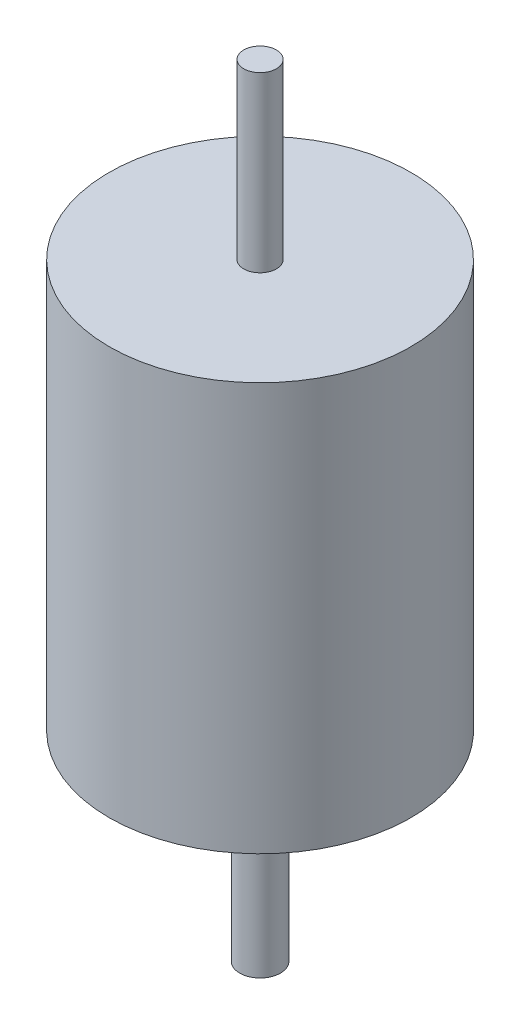
ISO-10303-21;
HEADER;
FILE_DESCRIPTION(('STEP AP214'),'2;1');
FILE_NAME('part.step','',(''),(''),'','','');
FILE_SCHEMA(('AUTOMOTIVE_DESIGN { 1 0 10303 214 1 1 1 1 }'));
ENDSEC;
DATA;
#1=APPLICATION_CONTEXT('core data for automotive mechanical design processes');
#2=APPLICATION_PROTOCOL_DEFINITION('international standard','automotive_design',2000,#1);
#3=PRODUCT_CONTEXT('',#1,'mechanical');
#4=PRODUCT('Part','Part','',(#3));
#5=PRODUCT_RELATED_PRODUCT_CATEGORY('part','',(#4));
#6=PRODUCT_DEFINITION_FORMATION('','',#4);
#7=PRODUCT_DEFINITION_CONTEXT('part definition',#1,'design');
#8=PRODUCT_DEFINITION('design','',#6,#7);
#9=PRODUCT_DEFINITION_SHAPE('','',#8);
#10=(LENGTH_UNIT() NAMED_UNIT(*) SI_UNIT(.MILLI.,.METRE.));
#11=(NAMED_UNIT(*) PLANE_ANGLE_UNIT() SI_UNIT($,.RADIAN.));
#12=(NAMED_UNIT(*) SI_UNIT($,.STERADIAN.) SOLID_ANGLE_UNIT());
#13=UNCERTAINTY_MEASURE_WITH_UNIT(LENGTH_MEASURE(1.E-05),#10,'distance_accuracy_value','');
#14=(GEOMETRIC_REPRESENTATION_CONTEXT(3) GLOBAL_UNCERTAINTY_ASSIGNED_CONTEXT((#13)) GLOBAL_UNIT_ASSIGNED_CONTEXT((#10,
#11,#12)) REPRESENTATION_CONTEXT('',''));
#15=CARTESIAN_POINT('',(0.,0.,0.));
#16=DIRECTION('',(0.,0.,1.));
#17=DIRECTION('',(1.,0.,0.));
#18=AXIS2_PLACEMENT_3D('',#15,#16,#17);
#19=CARTESIAN_POINT('',(0.,20.,0.));
#20=DIRECTION('',(0.,-1.,0.));
#21=DIRECTION('',(0.,0.,-1.));
#22=AXIS2_PLACEMENT_3D('',#19,#20,#21);
#23=CYLINDRICAL_SURFACE('',#22,7.4);
#24=CARTESIAN_POINT('',(0.,20.,0.));
#25=DIRECTION('',(0.,1.,0.));
#26=DIRECTION('',(0.,0.,1.));
#27=AXIS2_PLACEMENT_3D('',#24,#25,#26);
#28=CIRCLE('',#27,7.4);
#29=CARTESIAN_POINT('',(0.,20.,7.4));
#30=VERTEX_POINT('',#29);
#31=EDGE_CURVE('E42',#30,#30,#28,.T.);
#32=ORIENTED_EDGE('',*,*,#31,.F.);
#33=EDGE_LOOP('',(#32));
#34=FACE_BOUND('',#33,.T.);
#35=CARTESIAN_POINT('',(0.,0.,0.));
#36=DIRECTION('',(0.,1.,0.));
#37=DIRECTION('',(0.,0.,1.));
#38=AXIS2_PLACEMENT_3D('',#35,#36,#37);
#39=CIRCLE('',#38,7.4);
#40=CARTESIAN_POINT('',(0.,0.,7.4));
#41=VERTEX_POINT('',#40);
#42=EDGE_CURVE('E46',#41,#41,#39,.T.);
#43=ORIENTED_EDGE('',*,*,#42,.T.);
#44=EDGE_LOOP('',(#43));
#45=FACE_BOUND('',#44,.T.);
#46=ADVANCED_FACE('F36',(#34,#45),#23,.T.);
#47=CARTESIAN_POINT('',(0.,20.,0.));
#48=DIRECTION('',(0.,1.,0.));
#49=DIRECTION('',(0.,0.,1.));
#50=AXIS2_PLACEMENT_3D('',#47,#48,#49);
#51=PLANE('',#50);
#52=CARTESIAN_POINT('',(0.,20.,0.));
#53=DIRECTION('',(0.,1.,0.));
#54=DIRECTION('',(0.,0.,1.));
#55=AXIS2_PLACEMENT_3D('',#52,#53,#54);
#56=CIRCLE('',#55,0.8);
#57=CARTESIAN_POINT('',(0.,20.,0.8));
#58=VERTEX_POINT('',#57);
#59=EDGE_CURVE('E53',#58,#58,#56,.T.);
#60=ORIENTED_EDGE('',*,*,#59,.F.);
#61=EDGE_LOOP('',(#60));
#62=FACE_BOUND('',#61,.T.);
#63=ORIENTED_EDGE('',*,*,#31,.T.);
#64=EDGE_LOOP('',(#63));
#65=FACE_BOUND('',#64,.T.);
#66=ADVANCED_FACE('F77',(#62,#65),#51,.T.);
#67=CARTESIAN_POINT('',(0.,0.,0.));
#68=DIRECTION('',(0.,1.,0.));
#69=DIRECTION('',(0.,0.,1.));
#70=AXIS2_PLACEMENT_3D('',#67,#68,#69);
#71=PLANE('',#70);
#72=CARTESIAN_POINT('',(0.,0.,0.));
#73=DIRECTION('',(0.,1.,0.));
#74=DIRECTION('',(0.,0.,1.));
#75=AXIS2_PLACEMENT_3D('',#72,#73,#74);
#76=CIRCLE('',#75,1.);
#77=CARTESIAN_POINT('',(0.,0.,1.));
#78=VERTEX_POINT('',#77);
#79=EDGE_CURVE('E10',#78,#78,#76,.F.);
#80=ORIENTED_EDGE('',*,*,#79,.F.);
#81=EDGE_LOOP('',(#80));
#82=FACE_BOUND('',#81,.T.);
#83=ORIENTED_EDGE('',*,*,#42,.F.);
#84=EDGE_LOOP('',(#83));
#85=FACE_BOUND('',#84,.T.);
#86=ADVANCED_FACE('F82',(#82,#85),#71,.F.);
#87=CARTESIAN_POINT('',(0.,28.5,0.));
#88=DIRECTION('',(0.,-1.,0.));
#89=DIRECTION('',(0.,0.,-1.));
#90=AXIS2_PLACEMENT_3D('',#87,#88,#89);
#91=CYLINDRICAL_SURFACE('',#90,0.8);
#92=CARTESIAN_POINT('',(0.,28.5,0.));
#93=DIRECTION('',(0.,1.,0.));
#94=DIRECTION('',(0.,0.,1.));
#95=AXIS2_PLACEMENT_3D('',#92,#93,#94);
#96=CIRCLE('',#95,0.8);
#97=CARTESIAN_POINT('',(0.,28.5,0.8));
#98=VERTEX_POINT('',#97);
#99=EDGE_CURVE('E51',#98,#98,#96,.T.);
#100=ORIENTED_EDGE('',*,*,#99,.F.);
#101=EDGE_LOOP('',(#100));
#102=FACE_BOUND('',#101,.T.);
#103=ORIENTED_EDGE('',*,*,#59,.T.);
#104=EDGE_LOOP('',(#103));
#105=FACE_BOUND('',#104,.T.);
#106=ADVANCED_FACE('F73',(#102,#105),#91,.T.);
#107=CARTESIAN_POINT('',(0.,28.5,0.));
#108=DIRECTION('',(0.,1.,0.));
#109=DIRECTION('',(0.,0.,1.));
#110=AXIS2_PLACEMENT_3D('',#107,#108,#109);
#111=PLANE('',#110);
#112=ORIENTED_EDGE('',*,*,#99,.T.);
#113=EDGE_LOOP('',(#112));
#114=FACE_BOUND('',#113,.T.);
#115=ADVANCED_FACE('F66',(#114),#111,.T.);
#116=CARTESIAN_POINT('',(0.,-9.8,0.));
#117=DIRECTION('',(0.,1.,0.));
#118=DIRECTION('',(0.,0.,1.));
#119=AXIS2_PLACEMENT_3D('',#116,#117,#118);
#120=CYLINDRICAL_SURFACE('',#119,1.);
#121=CARTESIAN_POINT('',(0.,-9.8,0.));
#122=DIRECTION('',(0.,-1.,0.));
#123=DIRECTION('',(0.,0.,-1.));
#124=AXIS2_PLACEMENT_3D('',#121,#122,#123);
#125=CIRCLE('',#124,1.);
#126=CARTESIAN_POINT('',(0.,-9.8,-1.));
#127=VERTEX_POINT('',#126);
#128=EDGE_CURVE('E56',#127,#127,#125,.T.);
#129=ORIENTED_EDGE('',*,*,#128,.F.);
#130=EDGE_LOOP('',(#129));
#131=FACE_BOUND('',#130,.T.);
#132=ORIENTED_EDGE('',*,*,#79,.T.);
#133=EDGE_LOOP('',(#132));
#134=FACE_BOUND('',#133,.T.);
#135=ADVANCED_FACE('F64',(#131,#134),#120,.T.);
#136=CARTESIAN_POINT('',(0.,-9.8,0.));
#137=DIRECTION('',(0.,-1.,0.));
#138=DIRECTION('',(0.,0.,-1.));
#139=AXIS2_PLACEMENT_3D('',#136,#137,#138);
#140=PLANE('',#139);
#141=ORIENTED_EDGE('',*,*,#128,.T.);
#142=EDGE_LOOP('',(#141));
#143=FACE_BOUND('',#142,.T.);
#144=ADVANCED_FACE('F62',(#143),#140,.T.);
#145=CLOSED_SHELL('',(#46,#66,#86,#106,#115,#135,#144));
#146=MANIFOLD_SOLID_BREP('B2',#145);
#147=ADVANCED_BREP_SHAPE_REPRESENTATION('',(#18,#146),#14);
#148=SHAPE_DEFINITION_REPRESENTATION(#9,#147);
ENDSEC;
END-ISO-10303-21;
